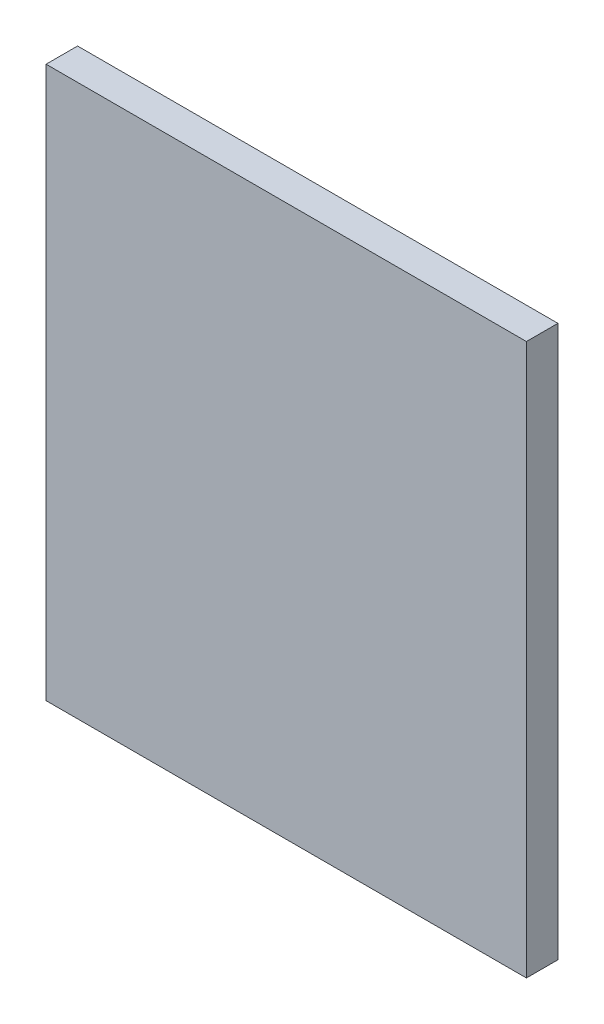
ISO-10303-21;
HEADER;
FILE_DESCRIPTION(('STEP AP214'),'2;1');
FILE_NAME('part.step','',(''),(''),'','','');
FILE_SCHEMA(('AUTOMOTIVE_DESIGN { 1 0 10303 214 1 1 1 1 }'));
ENDSEC;
DATA;
#1=APPLICATION_CONTEXT('core data for automotive mechanical design processes');
#2=APPLICATION_PROTOCOL_DEFINITION('international standard','automotive_design',2000,#1);
#3=PRODUCT_CONTEXT('',#1,'mechanical');
#4=PRODUCT('Part','Part','',(#3));
#5=PRODUCT_RELATED_PRODUCT_CATEGORY('part','',(#4));
#6=PRODUCT_DEFINITION_FORMATION('','',#4);
#7=PRODUCT_DEFINITION_CONTEXT('part definition',#1,'design');
#8=PRODUCT_DEFINITION('design','',#6,#7);
#9=PRODUCT_DEFINITION_SHAPE('','',#8);
#10=(LENGTH_UNIT() NAMED_UNIT(*) SI_UNIT(.MILLI.,.METRE.));
#11=(NAMED_UNIT(*) PLANE_ANGLE_UNIT() SI_UNIT($,.RADIAN.));
#12=(NAMED_UNIT(*) SI_UNIT($,.STERADIAN.) SOLID_ANGLE_UNIT());
#13=UNCERTAINTY_MEASURE_WITH_UNIT(LENGTH_MEASURE(1.E-05),#10,'distance_accuracy_value','');
#14=(GEOMETRIC_REPRESENTATION_CONTEXT(3) GLOBAL_UNCERTAINTY_ASSIGNED_CONTEXT((#13)) GLOBAL_UNIT_ASSIGNED_CONTEXT((#10,
#11,#12)) REPRESENTATION_CONTEXT('',''));
#15=CARTESIAN_POINT('',(0.,0.,0.));
#16=DIRECTION('',(0.,0.,1.));
#17=DIRECTION('',(1.,0.,0.));
#18=AXIS2_PLACEMENT_3D('',#15,#16,#17);
#19=CARTESIAN_POINT('',(-0.1375,0.025,0.));
#20=DIRECTION('',(0.,0.,1.));
#21=DIRECTION('',(1.,0.,0.));
#22=AXIS2_PLACEMENT_3D('',#19,#20,#21);
#23=PLANE('',#22);
#24=DIRECTION('',(1.,0.,0.));
#25=VECTOR('',#24,1.);
#26=CARTESIAN_POINT('',(-0.1375,0.9,0.));
#27=LINE('',#26,#25);
#28=CARTESIAN_POINT('',(0.625,0.9,0.));
#29=VERTEX_POINT('',#28);
#30=CARTESIAN_POINT('',(-0.9,0.9,0.));
#31=VERTEX_POINT('',#30);
#32=EDGE_CURVE('E20',#29,#31,#27,.F.);
#33=ORIENTED_EDGE('',*,*,#32,.F.);
#34=DIRECTION('',(0.,1.,0.));
#35=VECTOR('',#34,1.);
#36=CARTESIAN_POINT('',(0.625,-0.85,0.));
#37=LINE('',#36,#35);
#38=CARTESIAN_POINT('',(0.625,-0.85,0.));
#39=VERTEX_POINT('',#38);
#40=EDGE_CURVE('E55',#39,#29,#37,.T.);
#41=ORIENTED_EDGE('',*,*,#40,.F.);
#42=DIRECTION('',(1.,0.,0.));
#43=VECTOR('',#42,1.);
#44=CARTESIAN_POINT('',(-0.9,-0.85,0.));
#45=LINE('',#44,#43);
#46=CARTESIAN_POINT('',(-0.9,-0.85,0.));
#47=VERTEX_POINT('',#46);
#48=EDGE_CURVE('E58',#47,#39,#45,.T.);
#49=ORIENTED_EDGE('',*,*,#48,.F.);
#50=DIRECTION('',(0.,-1.,0.));
#51=VECTOR('',#50,1.);
#52=CARTESIAN_POINT('',(-0.9,0.9,0.));
#53=LINE('',#52,#51);
#54=EDGE_CURVE('E60',#31,#47,#53,.T.);
#55=ORIENTED_EDGE('',*,*,#54,.F.);
#56=EDGE_LOOP('',(#33,#41,#49,#55));
#57=FACE_BOUND('',#56,.T.);
#58=ADVANCED_FACE('F17',(#57),#23,.F.);
#59=CARTESIAN_POINT('',(-0.9,0.9,0.));
#60=DIRECTION('',(-1.,0.,0.));
#61=DIRECTION('',(0.,-1.,0.));
#62=AXIS2_PLACEMENT_3D('',#59,#60,#61);
#63=PLANE('',#62);
#64=DIRECTION('',(0.,1.,0.));
#65=VECTOR('',#64,1.);
#66=CARTESIAN_POINT('',(-0.9,0.025,0.1));
#67=LINE('',#66,#65);
#68=CARTESIAN_POINT('',(-0.9,0.9,0.1));
#69=VERTEX_POINT('',#68);
#70=CARTESIAN_POINT('',(-0.9,-0.85,0.1));
#71=VERTEX_POINT('',#70);
#72=EDGE_CURVE('E83',#69,#71,#67,.F.);
#73=ORIENTED_EDGE('',*,*,#72,.F.);
#74=DIRECTION('',(0.,0.,1.));
#75=VECTOR('',#74,1.);
#76=CARTESIAN_POINT('',(-0.9,0.9,0.));
#77=LINE('',#76,#75);
#78=EDGE_CURVE('E71',#31,#69,#77,.T.);
#79=ORIENTED_EDGE('',*,*,#78,.F.);
#80=ORIENTED_EDGE('',*,*,#54,.T.);
#81=DIRECTION('',(0.,0.,-1.));
#82=VECTOR('',#81,1.);
#83=CARTESIAN_POINT('',(-0.9,-0.85,0.));
#84=LINE('',#83,#82);
#85=EDGE_CURVE('E65',#71,#47,#84,.T.);
#86=ORIENTED_EDGE('',*,*,#85,.F.);
#87=EDGE_LOOP('',(#73,#79,#80,#86));
#88=FACE_BOUND('',#87,.T.);
#89=ADVANCED_FACE('F68',(#88),#63,.T.);
#90=CARTESIAN_POINT('',(-0.9,-0.85,0.));
#91=DIRECTION('',(0.,-1.,0.));
#92=DIRECTION('',(0.,0.,-1.));
#93=AXIS2_PLACEMENT_3D('',#90,#91,#92);
#94=PLANE('',#93);
#95=DIRECTION('',(1.,0.,0.));
#96=VECTOR('',#95,1.);
#97=CARTESIAN_POINT('',(-0.1375,-0.85,0.1));
#98=LINE('',#97,#96);
#99=CARTESIAN_POINT('',(0.625,-0.85,0.1));
#100=VERTEX_POINT('',#99);
#101=EDGE_CURVE('E74',#71,#100,#98,.T.);
#102=ORIENTED_EDGE('',*,*,#101,.F.);
#103=ORIENTED_EDGE('',*,*,#85,.T.);
#104=ORIENTED_EDGE('',*,*,#48,.T.);
#105=DIRECTION('',(0.,0.,1.));
#106=VECTOR('',#105,1.);
#107=CARTESIAN_POINT('',(0.625,-0.85,0.));
#108=LINE('',#107,#106);
#109=EDGE_CURVE('E77',#100,#39,#108,.F.);
#110=ORIENTED_EDGE('',*,*,#109,.F.);
#111=EDGE_LOOP('',(#102,#103,#104,#110));
#112=FACE_BOUND('',#111,.T.);
#113=ADVANCED_FACE('F72',(#112),#94,.T.);
#114=CARTESIAN_POINT('',(0.625,-0.85,0.));
#115=DIRECTION('',(1.,0.,0.));
#116=DIRECTION('',(0.,1.,0.));
#117=AXIS2_PLACEMENT_3D('',#114,#115,#116);
#118=PLANE('',#117);
#119=DIRECTION('',(0.,1.,0.));
#120=VECTOR('',#119,1.);
#121=CARTESIAN_POINT('',(0.625,0.025,0.1));
#122=LINE('',#121,#120);
#123=CARTESIAN_POINT('',(0.625,0.9,0.1));
#124=VERTEX_POINT('',#123);
#125=EDGE_CURVE('E26',#100,#124,#122,.T.);
#126=ORIENTED_EDGE('',*,*,#125,.F.);
#127=ORIENTED_EDGE('',*,*,#109,.T.);
#128=ORIENTED_EDGE('',*,*,#40,.T.);
#129=DIRECTION('',(0.,0.,1.));
#130=VECTOR('',#129,1.);
#131=CARTESIAN_POINT('',(0.625,0.9,0.));
#132=LINE('',#131,#130);
#133=EDGE_CURVE('E35',#124,#29,#132,.F.);
#134=ORIENTED_EDGE('',*,*,#133,.F.);
#135=EDGE_LOOP('',(#126,#127,#128,#134));
#136=FACE_BOUND('',#135,.T.);
#137=ADVANCED_FACE('F89',(#136),#118,.T.);
#138=CARTESIAN_POINT('',(0.625,0.9,0.));
#139=DIRECTION('',(0.,1.,0.));
#140=DIRECTION('',(0.,0.,1.));
#141=AXIS2_PLACEMENT_3D('',#138,#139,#140);
#142=PLANE('',#141);
#143=DIRECTION('',(1.,0.,0.));
#144=VECTOR('',#143,1.);
#145=CARTESIAN_POINT('',(-0.1375,0.9,0.1));
#146=LINE('',#145,#144);
#147=EDGE_CURVE('E11',#124,#69,#146,.F.);
#148=ORIENTED_EDGE('',*,*,#147,.F.);
#149=ORIENTED_EDGE('',*,*,#133,.T.);
#150=ORIENTED_EDGE('',*,*,#32,.T.);
#151=ORIENTED_EDGE('',*,*,#78,.T.);
#152=EDGE_LOOP('',(#148,#149,#150,#151));
#153=FACE_BOUND('',#152,.T.);
#154=ADVANCED_FACE('F91',(#153),#142,.T.);
#155=CARTESIAN_POINT('',(-0.1375,0.025,0.1));
#156=DIRECTION('',(0.,0.,1.));
#157=DIRECTION('',(1.,0.,0.));
#158=AXIS2_PLACEMENT_3D('',#155,#156,#157);
#159=PLANE('',#158);
#160=ORIENTED_EDGE('',*,*,#125,.T.);
#161=ORIENTED_EDGE('',*,*,#147,.T.);
#162=ORIENTED_EDGE('',*,*,#72,.T.);
#163=ORIENTED_EDGE('',*,*,#101,.T.);
#164=EDGE_LOOP('',(#160,#161,#162,#163));
#165=FACE_BOUND('',#164,.T.);
#166=ADVANCED_FACE('F88',(#165),#159,.T.);
#167=CLOSED_SHELL('',(#58,#89,#113,#137,#154,#166));
#168=MANIFOLD_SOLID_BREP('B1',#167);
#169=ADVANCED_BREP_SHAPE_REPRESENTATION('',(#18,#168),#14);
#170=SHAPE_DEFINITION_REPRESENTATION(#9,#169);
ENDSEC;
END-ISO-10303-21;
